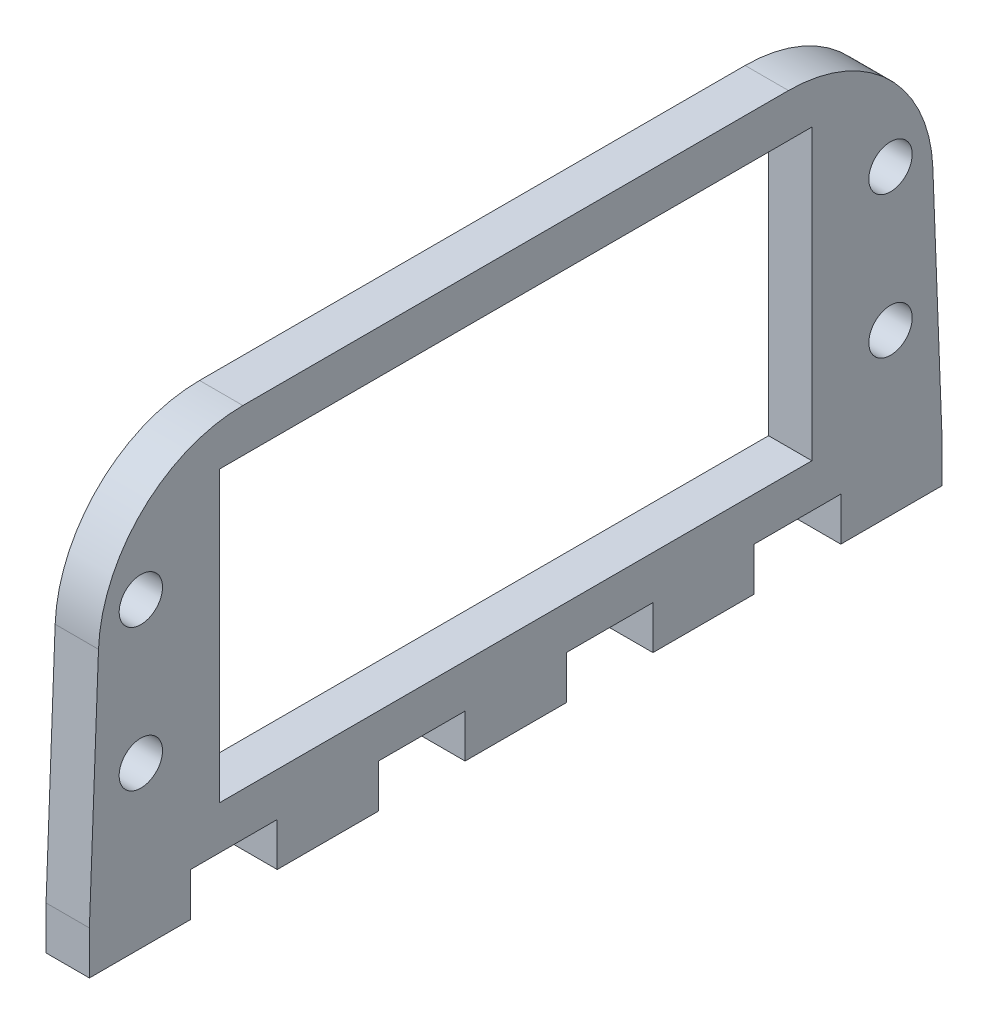
ISO-10303-21;
HEADER;
FILE_DESCRIPTION(('STEP AP214'),'2;1');
FILE_NAME('part.step','',(''),(''),'','','');
FILE_SCHEMA(('AUTOMOTIVE_DESIGN { 1 0 10303 214 1 1 1 1 }'));
ENDSEC;
DATA;
#1=APPLICATION_CONTEXT('core data for automotive mechanical design processes');
#2=APPLICATION_PROTOCOL_DEFINITION('international standard','automotive_design',2000,#1);
#3=PRODUCT_CONTEXT('',#1,'mechanical');
#4=PRODUCT('Part','Part','',(#3));
#5=PRODUCT_RELATED_PRODUCT_CATEGORY('part','',(#4));
#6=PRODUCT_DEFINITION_FORMATION('','',#4);
#7=PRODUCT_DEFINITION_CONTEXT('part definition',#1,'design');
#8=PRODUCT_DEFINITION('design','',#6,#7);
#9=PRODUCT_DEFINITION_SHAPE('','',#8);
#10=(LENGTH_UNIT() NAMED_UNIT(*) SI_UNIT(.MILLI.,.METRE.));
#11=(NAMED_UNIT(*) PLANE_ANGLE_UNIT() SI_UNIT($,.RADIAN.));
#12=(NAMED_UNIT(*) SI_UNIT($,.STERADIAN.) SOLID_ANGLE_UNIT());
#13=UNCERTAINTY_MEASURE_WITH_UNIT(LENGTH_MEASURE(1.E-05),#10,'distance_accuracy_value','');
#14=(GEOMETRIC_REPRESENTATION_CONTEXT(3) GLOBAL_UNCERTAINTY_ASSIGNED_CONTEXT((#13)) GLOBAL_UNIT_ASSIGNED_CONTEXT((#10,
#11,#12)) REPRESENTATION_CONTEXT('',''));
#15=CARTESIAN_POINT('',(0.,0.,0.));
#16=DIRECTION('',(0.,0.,1.));
#17=DIRECTION('',(1.,0.,0.));
#18=AXIS2_PLACEMENT_3D('',#15,#16,#17);
#19=CARTESIAN_POINT('',(3.,0.,0.));
#20=DIRECTION('',(-1.,0.,0.));
#21=DIRECTION('',(0.,0.,1.));
#22=AXIS2_PLACEMENT_3D('',#19,#20,#21);
#23=PLANE('',#22);
#24=CARTESIAN_POINT('',(3.,17.9,29.44));
#25=DIRECTION('',(1.,0.,0.));
#26=DIRECTION('',(0.,0.,1.));
#27=AXIS2_PLACEMENT_3D('',#24,#25,#26);
#28=CIRCLE('',#27,1.5);
#29=CARTESIAN_POINT('',(3.,17.9,30.94));
#30=VERTEX_POINT('',#29);
#31=EDGE_CURVE('E837',#30,#30,#28,.T.);
#32=ORIENTED_EDGE('',*,*,#31,.F.);
#33=EDGE_LOOP('',(#32));
#34=FACE_BOUND('',#33,.T.);
#35=CARTESIAN_POINT('',(3.,17.9,-22.44));
#36=DIRECTION('',(1.,0.,0.));
#37=DIRECTION('',(0.,0.,-1.));
#38=AXIS2_PLACEMENT_3D('',#35,#36,#37);
#39=CIRCLE('',#38,1.5);
#40=CARTESIAN_POINT('',(3.,17.9,-23.94));
#41=VERTEX_POINT('',#40);
#42=EDGE_CURVE('E254',#41,#41,#39,.T.);
#43=ORIENTED_EDGE('',*,*,#42,.F.);
#44=EDGE_LOOP('',(#43));
#45=FACE_BOUND('',#44,.T.);
#46=DIRECTION('',(0.,0.,1.));
#47=VECTOR('',#46,1.);
#48=CARTESIAN_POINT('',(3.,26.,32.));
#49=LINE('',#48,#47);
#50=CARTESIAN_POINT('',(3.,26.,-15.3772216682633));
#51=VERTEX_POINT('',#50);
#52=CARTESIAN_POINT('',(3.,26.,22.3772216682634));
#53=VERTEX_POINT('',#52);
#54=EDGE_CURVE('E307',#51,#53,#49,.T.);
#55=ORIENTED_EDGE('',*,*,#54,.T.);
#56=CARTESIAN_POINT('',(3.,16.,22.3772216682634));
#57=DIRECTION('',(-1.,0.,0.));
#58=DIRECTION('',(0.,0.,1.));
#59=AXIS2_PLACEMENT_3D('',#56,#57,#58);
#60=CIRCLE('',#59,10.);
#61=CARTESIAN_POINT('',(3.,16.3843312210121,32.3698334145765));
#62=VERTEX_POINT('',#61);
#63=EDGE_CURVE('E41',#53,#62,#60,.F.);
#64=ORIENTED_EDGE('',*,*,#63,.T.);
#65=DIRECTION('',(0.,-0.999261174631314,0.0384331221012095));
#66=VECTOR('',#65,1.);
#67=CARTESIAN_POINT('',(3.,0.,33.0000000000001));
#68=LINE('',#67,#66);
#69=CARTESIAN_POINT('',(3.,0.,33.0000000000001));
#70=VERTEX_POINT('',#69);
#71=EDGE_CURVE('E309',#62,#70,#68,.T.);
#72=ORIENTED_EDGE('',*,*,#71,.T.);
#73=DIRECTION('',(0.,-1.,0.));
#74=VECTOR('',#73,1.);
#75=CARTESIAN_POINT('',(3.,-3.,33.0000000000001));
#76=LINE('',#75,#74);
#77=CARTESIAN_POINT('',(3.,-3.,33.0000000000001));
#78=VERTEX_POINT('',#77);
#79=EDGE_CURVE('E265',#70,#78,#76,.T.);
#80=ORIENTED_EDGE('',*,*,#79,.T.);
#81=DIRECTION('',(0.,0.,-1.));
#82=VECTOR('',#81,1.);
#83=CARTESIAN_POINT('',(3.,-3.,26.0000000000001));
#84=LINE('',#83,#82);
#85=CARTESIAN_POINT('',(3.,-3.,26.0000000000001));
#86=VERTEX_POINT('',#85);
#87=EDGE_CURVE('E268',#78,#86,#84,.T.);
#88=ORIENTED_EDGE('',*,*,#87,.T.);
#89=DIRECTION('',(0.,1.,0.));
#90=VECTOR('',#89,1.);
#91=CARTESIAN_POINT('',(3.,0.,26.0000000000001));
#92=LINE('',#91,#90);
#93=CARTESIAN_POINT('',(3.,0.,26.0000000000001));
#94=VERTEX_POINT('',#93);
#95=EDGE_CURVE('E271',#86,#94,#92,.T.);
#96=ORIENTED_EDGE('',*,*,#95,.T.);
#97=DIRECTION('',(0.,0.,-1.));
#98=VECTOR('',#97,1.);
#99=CARTESIAN_POINT('',(3.,0.,20.0000000000001));
#100=LINE('',#99,#98);
#101=CARTESIAN_POINT('',(3.,0.,20.0000000000001));
#102=VERTEX_POINT('',#101);
#103=EDGE_CURVE('E273',#94,#102,#100,.T.);
#104=ORIENTED_EDGE('',*,*,#103,.T.);
#105=DIRECTION('',(0.,-1.,0.));
#106=VECTOR('',#105,1.);
#107=CARTESIAN_POINT('',(3.,-3.,20.0000000000001));
#108=LINE('',#107,#106);
#109=CARTESIAN_POINT('',(3.,-3.,20.0000000000001));
#110=VERTEX_POINT('',#109);
#111=EDGE_CURVE('E275',#102,#110,#108,.T.);
#112=ORIENTED_EDGE('',*,*,#111,.T.);
#113=DIRECTION('',(0.,0.,-1.));
#114=VECTOR('',#113,1.);
#115=CARTESIAN_POINT('',(3.,-3.,13.0000000000001));
#116=LINE('',#115,#114);
#117=CARTESIAN_POINT('',(3.,-3.,13.0000000000001));
#118=VERTEX_POINT('',#117);
#119=EDGE_CURVE('E277',#110,#118,#116,.T.);
#120=ORIENTED_EDGE('',*,*,#119,.T.);
#121=DIRECTION('',(0.,1.,0.));
#122=VECTOR('',#121,1.);
#123=CARTESIAN_POINT('',(3.,0.,13.0000000000001));
#124=LINE('',#123,#122);
#125=CARTESIAN_POINT('',(3.,0.,13.0000000000001));
#126=VERTEX_POINT('',#125);
#127=EDGE_CURVE('E279',#118,#126,#124,.T.);
#128=ORIENTED_EDGE('',*,*,#127,.T.);
#129=DIRECTION('',(0.,0.,-1.));
#130=VECTOR('',#129,1.);
#131=CARTESIAN_POINT('',(3.,0.,7.00000000000027));
#132=LINE('',#131,#130);
#133=CARTESIAN_POINT('',(3.,0.,7.00000000000027));
#134=VERTEX_POINT('',#133);
#135=EDGE_CURVE('E281',#126,#134,#132,.T.);
#136=ORIENTED_EDGE('',*,*,#135,.T.);
#137=DIRECTION('',(0.,-1.,0.));
#138=VECTOR('',#137,1.);
#139=CARTESIAN_POINT('',(3.,-3.,7.00000000000018));
#140=LINE('',#139,#138);
#141=CARTESIAN_POINT('',(3.,-3.,7.00000000000018));
#142=VERTEX_POINT('',#141);
#143=EDGE_CURVE('E283',#134,#142,#140,.T.);
#144=ORIENTED_EDGE('',*,*,#143,.T.);
#145=DIRECTION('',(0.,0.,-1.));
#146=VECTOR('',#145,1.);
#147=CARTESIAN_POINT('',(3.,-3.,0.));
#148=LINE('',#147,#146);
#149=CARTESIAN_POINT('',(3.,-3.,0.));
#150=VERTEX_POINT('',#149);
#151=EDGE_CURVE('E285',#142,#150,#148,.T.);
#152=ORIENTED_EDGE('',*,*,#151,.T.);
#153=DIRECTION('',(0.,1.,0.));
#154=VECTOR('',#153,1.);
#155=CARTESIAN_POINT('',(3.,0.,0.));
#156=LINE('',#155,#154);
#157=CARTESIAN_POINT('',(3.,0.,0.));
#158=VERTEX_POINT('',#157);
#159=EDGE_CURVE('E287',#150,#158,#156,.T.);
#160=ORIENTED_EDGE('',*,*,#159,.T.);
#161=DIRECTION('',(0.,0.,-1.));
#162=VECTOR('',#161,1.);
#163=CARTESIAN_POINT('',(3.,0.,-6.00000000000001));
#164=LINE('',#163,#162);
#165=CARTESIAN_POINT('',(3.,0.,-6.00000000000001));
#166=VERTEX_POINT('',#165);
#167=EDGE_CURVE('E289',#158,#166,#164,.T.);
#168=ORIENTED_EDGE('',*,*,#167,.T.);
#169=DIRECTION('',(0.,-1.,0.));
#170=VECTOR('',#169,1.);
#171=CARTESIAN_POINT('',(3.,-3.,-6.00000000000001));
#172=LINE('',#171,#170);
#173=CARTESIAN_POINT('',(3.,-3.,-6.00000000000001));
#174=VERTEX_POINT('',#173);
#175=EDGE_CURVE('E291',#166,#174,#172,.T.);
#176=ORIENTED_EDGE('',*,*,#175,.T.);
#177=DIRECTION('',(0.,0.,-1.));
#178=VECTOR('',#177,1.);
#179=CARTESIAN_POINT('',(3.,-3.,-13.));
#180=LINE('',#179,#178);
#181=CARTESIAN_POINT('',(3.,-3.,-13.));
#182=VERTEX_POINT('',#181);
#183=EDGE_CURVE('E293',#174,#182,#180,.T.);
#184=ORIENTED_EDGE('',*,*,#183,.T.);
#185=DIRECTION('',(0.,1.,0.));
#186=VECTOR('',#185,1.);
#187=CARTESIAN_POINT('',(3.,0.,-13.));
#188=LINE('',#187,#186);
#189=CARTESIAN_POINT('',(3.,0.,-13.));
#190=VERTEX_POINT('',#189);
#191=EDGE_CURVE('E295',#182,#190,#188,.T.);
#192=ORIENTED_EDGE('',*,*,#191,.T.);
#193=DIRECTION('',(0.,0.,-1.));
#194=VECTOR('',#193,1.);
#195=CARTESIAN_POINT('',(3.,0.,-19.));
#196=LINE('',#195,#194);
#197=CARTESIAN_POINT('',(3.,0.,-19.));
#198=VERTEX_POINT('',#197);
#199=EDGE_CURVE('E297',#190,#198,#196,.T.);
#200=ORIENTED_EDGE('',*,*,#199,.T.);
#201=DIRECTION('',(0.,-1.,0.));
#202=VECTOR('',#201,1.);
#203=CARTESIAN_POINT('',(3.,-3.,-19.));
#204=LINE('',#203,#202);
#205=CARTESIAN_POINT('',(3.,-3.,-19.));
#206=VERTEX_POINT('',#205);
#207=EDGE_CURVE('E299',#198,#206,#204,.T.);
#208=ORIENTED_EDGE('',*,*,#207,.T.);
#209=DIRECTION('',(0.,0.,-1.));
#210=VECTOR('',#209,1.);
#211=CARTESIAN_POINT('',(3.,-3.,-26.));
#212=LINE('',#211,#210);
#213=CARTESIAN_POINT('',(3.,-3.,-26.));
#214=VERTEX_POINT('',#213);
#215=EDGE_CURVE('E301',#206,#214,#212,.T.);
#216=ORIENTED_EDGE('',*,*,#215,.T.);
#217=DIRECTION('',(0.,1.,0.));
#218=VECTOR('',#217,1.);
#219=CARTESIAN_POINT('',(3.,0.,-26.0000000000001));
#220=LINE('',#219,#218);
#221=CARTESIAN_POINT('',(3.,0.,-26.0000000000001));
#222=VERTEX_POINT('',#221);
#223=EDGE_CURVE('E303',#214,#222,#220,.T.);
#224=ORIENTED_EDGE('',*,*,#223,.T.);
#225=DIRECTION('',(0.,0.999261174631314,0.0384331221012076));
#226=VECTOR('',#225,1.);
#227=CARTESIAN_POINT('',(3.,26.,-25.));
#228=LINE('',#227,#226);
#229=CARTESIAN_POINT('',(3.,16.3843312210121,-25.3698334145765));
#230=VERTEX_POINT('',#229);
#231=EDGE_CURVE('E305',#222,#230,#228,.T.);
#232=ORIENTED_EDGE('',*,*,#231,.T.);
#233=CARTESIAN_POINT('',(3.,16.,-15.3772216682634));
#234=DIRECTION('',(-1.,0.,0.));
#235=DIRECTION('',(0.,0.,1.));
#236=AXIS2_PLACEMENT_3D('',#233,#234,#235);
#237=CIRCLE('',#236,10.);
#238=EDGE_CURVE('E425',#230,#51,#237,.F.);
#239=ORIENTED_EDGE('',*,*,#238,.T.);
#240=EDGE_LOOP('',(#55,#64,#72,#80,#88,#96,#104,#112,#120,#128,#136,#144,#152,#160,#168,#176,
#184,#192,#200,#208,#216,#224,#232,#239));
#241=FACE_BOUND('',#240,.T.);
#242=DIRECTION('',(0.,1.,0.));
#243=VECTOR('',#242,1.);
#244=CARTESIAN_POINT('',(3.,23.,-17.));
#245=LINE('',#244,#243);
#246=CARTESIAN_POINT('',(3.,3.,-17.));
#247=VERTEX_POINT('',#246);
#248=CARTESIAN_POINT('',(3.,23.,-17.));
#249=VERTEX_POINT('',#248);
#250=EDGE_CURVE('E221',#247,#249,#245,.T.);
#251=ORIENTED_EDGE('',*,*,#250,.F.);
#252=DIRECTION('',(0.,0.,-1.));
#253=VECTOR('',#252,1.);
#254=CARTESIAN_POINT('',(3.,3.,24.));
#255=LINE('',#254,#253);
#256=CARTESIAN_POINT('',(3.,3.,24.));
#257=VERTEX_POINT('',#256);
#258=EDGE_CURVE('E247',#257,#247,#255,.T.);
#259=ORIENTED_EDGE('',*,*,#258,.F.);
#260=DIRECTION('',(0.,-1.,0.));
#261=VECTOR('',#260,1.);
#262=CARTESIAN_POINT('',(3.,23.,24.));
#263=LINE('',#262,#261);
#264=CARTESIAN_POINT('',(3.,23.,24.));
#265=VERTEX_POINT('',#264);
#266=EDGE_CURVE('E245',#265,#257,#263,.T.);
#267=ORIENTED_EDGE('',*,*,#266,.F.);
#268=DIRECTION('',(0.,0.,1.));
#269=VECTOR('',#268,1.);
#270=CARTESIAN_POINT('',(3.,23.,24.));
#271=LINE('',#270,#269);
#272=EDGE_CURVE('E231',#249,#265,#271,.T.);
#273=ORIENTED_EDGE('',*,*,#272,.F.);
#274=EDGE_LOOP('',(#251,#259,#267,#273));
#275=FACE_BOUND('',#274,.T.);
#276=CARTESIAN_POINT('',(3.,8.1,-22.44));
#277=DIRECTION('',(1.,0.,0.));
#278=DIRECTION('',(0.,0.,1.));
#279=AXIS2_PLACEMENT_3D('',#276,#277,#278);
#280=CIRCLE('',#279,1.5);
#281=CARTESIAN_POINT('',(3.,8.1,-20.94));
#282=VERTEX_POINT('',#281);
#283=EDGE_CURVE('E843',#282,#282,#280,.T.);
#284=ORIENTED_EDGE('',*,*,#283,.F.);
#285=EDGE_LOOP('',(#284));
#286=FACE_BOUND('',#285,.T.);
#287=CARTESIAN_POINT('',(3.,8.1,29.44));
#288=DIRECTION('',(1.,0.,0.));
#289=DIRECTION('',(0.,0.,-1.));
#290=AXIS2_PLACEMENT_3D('',#287,#288,#289);
#291=CIRCLE('',#290,1.5);
#292=CARTESIAN_POINT('',(3.,8.1,27.94));
#293=VERTEX_POINT('',#292);
#294=EDGE_CURVE('E828',#293,#293,#291,.T.);
#295=ORIENTED_EDGE('',*,*,#294,.F.);
#296=EDGE_LOOP('',(#295));
#297=FACE_BOUND('',#296,.T.);
#298=ADVANCED_FACE('F33',(#34,#45,#241,#275,#286,#297),#23,.F.);
#299=CARTESIAN_POINT('',(0.,0.,0.));
#300=DIRECTION('',(-1.,0.,0.));
#301=DIRECTION('',(0.,0.,1.));
#302=AXIS2_PLACEMENT_3D('',#299,#300,#301);
#303=PLANE('',#302);
#304=CARTESIAN_POINT('',(0.,17.9,29.44));
#305=DIRECTION('',(1.,0.,0.));
#306=DIRECTION('',(0.,0.,1.));
#307=AXIS2_PLACEMENT_3D('',#304,#305,#306);
#308=CIRCLE('',#307,1.5);
#309=CARTESIAN_POINT('',(0.,17.9,30.94));
#310=VERTEX_POINT('',#309);
#311=EDGE_CURVE('E834',#310,#310,#308,.T.);
#312=ORIENTED_EDGE('',*,*,#311,.T.);
#313=EDGE_LOOP('',(#312));
#314=FACE_BOUND('',#313,.T.);
#315=CARTESIAN_POINT('',(0.,17.9,-22.44));
#316=DIRECTION('',(1.,0.,0.));
#317=DIRECTION('',(0.,0.,-1.));
#318=AXIS2_PLACEMENT_3D('',#315,#316,#317);
#319=CIRCLE('',#318,1.5);
#320=CARTESIAN_POINT('',(0.,17.9,-23.94));
#321=VERTEX_POINT('',#320);
#322=EDGE_CURVE('E846',#321,#321,#319,.T.);
#323=ORIENTED_EDGE('',*,*,#322,.T.);
#324=EDGE_LOOP('',(#323));
#325=FACE_BOUND('',#324,.T.);
#326=DIRECTION('',(0.,-0.999261174631314,0.0384331221012095));
#327=VECTOR('',#326,1.);
#328=CARTESIAN_POINT('',(0.,0.,33.0000000000001));
#329=LINE('',#328,#327);
#330=CARTESIAN_POINT('',(0.,16.3843312210121,32.3698334145765));
#331=VERTEX_POINT('',#330);
#332=CARTESIAN_POINT('',(0.,0.,33.0000000000001));
#333=VERTEX_POINT('',#332);
#334=EDGE_CURVE('E269',#331,#333,#329,.T.);
#335=ORIENTED_EDGE('',*,*,#334,.F.);
#336=CARTESIAN_POINT('',(0.,16.,22.3772216682634));
#337=DIRECTION('',(-1.,0.,0.));
#338=DIRECTION('',(0.,0.,1.));
#339=AXIS2_PLACEMENT_3D('',#336,#337,#338);
#340=CIRCLE('',#339,10.);
#341=CARTESIAN_POINT('',(0.,26.,22.3772216682634));
#342=VERTEX_POINT('',#341);
#343=EDGE_CURVE('E419',#331,#342,#340,.T.);
#344=ORIENTED_EDGE('',*,*,#343,.T.);
#345=DIRECTION('',(0.,0.,1.));
#346=VECTOR('',#345,1.);
#347=CARTESIAN_POINT('',(0.,26.,32.));
#348=LINE('',#347,#346);
#349=CARTESIAN_POINT('',(0.,26.,-15.3772216682633));
#350=VERTEX_POINT('',#349);
#351=EDGE_CURVE('E352',#350,#342,#348,.T.);
#352=ORIENTED_EDGE('',*,*,#351,.F.);
#353=CARTESIAN_POINT('',(0.,16.,-15.3772216682634));
#354=DIRECTION('',(-1.,0.,0.));
#355=DIRECTION('',(0.,0.,1.));
#356=AXIS2_PLACEMENT_3D('',#353,#354,#355);
#357=CIRCLE('',#356,10.);
#358=CARTESIAN_POINT('',(0.,16.3843312210121,-25.3698334145765));
#359=VERTEX_POINT('',#358);
#360=EDGE_CURVE('E417',#350,#359,#357,.T.);
#361=ORIENTED_EDGE('',*,*,#360,.T.);
#362=DIRECTION('',(0.,0.999261174631314,0.0384331221012076));
#363=VECTOR('',#362,1.);
#364=CARTESIAN_POINT('',(0.,26.,-25.));
#365=LINE('',#364,#363);
#366=CARTESIAN_POINT('',(0.,0.,-26.0000000000001));
#367=VERTEX_POINT('',#366);
#368=EDGE_CURVE('E350',#367,#359,#365,.T.);
#369=ORIENTED_EDGE('',*,*,#368,.F.);
#370=DIRECTION('',(0.,1.,0.));
#371=VECTOR('',#370,1.);
#372=CARTESIAN_POINT('',(0.,0.,-26.0000000000001));
#373=LINE('',#372,#371);
#374=CARTESIAN_POINT('',(0.,-3.,-26.));
#375=VERTEX_POINT('',#374);
#376=EDGE_CURVE('E348',#375,#367,#373,.T.);
#377=ORIENTED_EDGE('',*,*,#376,.F.);
#378=DIRECTION('',(0.,0.,-1.));
#379=VECTOR('',#378,1.);
#380=CARTESIAN_POINT('',(0.,-3.,-26.));
#381=LINE('',#380,#379);
#382=CARTESIAN_POINT('',(0.,-3.,-19.));
#383=VERTEX_POINT('',#382);
#384=EDGE_CURVE('E346',#383,#375,#381,.T.);
#385=ORIENTED_EDGE('',*,*,#384,.F.);
#386=DIRECTION('',(0.,-1.,0.));
#387=VECTOR('',#386,1.);
#388=CARTESIAN_POINT('',(0.,-3.,-19.));
#389=LINE('',#388,#387);
#390=CARTESIAN_POINT('',(0.,0.,-19.));
#391=VERTEX_POINT('',#390);
#392=EDGE_CURVE('E344',#391,#383,#389,.T.);
#393=ORIENTED_EDGE('',*,*,#392,.F.);
#394=DIRECTION('',(0.,0.,-1.));
#395=VECTOR('',#394,1.);
#396=CARTESIAN_POINT('',(0.,0.,-19.));
#397=LINE('',#396,#395);
#398=CARTESIAN_POINT('',(0.,0.,-13.));
#399=VERTEX_POINT('',#398);
#400=EDGE_CURVE('E342',#399,#391,#397,.T.);
#401=ORIENTED_EDGE('',*,*,#400,.F.);
#402=DIRECTION('',(0.,1.,0.));
#403=VECTOR('',#402,1.);
#404=CARTESIAN_POINT('',(0.,0.,-13.));
#405=LINE('',#404,#403);
#406=CARTESIAN_POINT('',(0.,-3.,-13.));
#407=VERTEX_POINT('',#406);
#408=EDGE_CURVE('E340',#407,#399,#405,.T.);
#409=ORIENTED_EDGE('',*,*,#408,.F.);
#410=DIRECTION('',(0.,0.,-1.));
#411=VECTOR('',#410,1.);
#412=CARTESIAN_POINT('',(0.,-3.,-13.));
#413=LINE('',#412,#411);
#414=CARTESIAN_POINT('',(0.,-3.,-6.00000000000001));
#415=VERTEX_POINT('',#414);
#416=EDGE_CURVE('E338',#415,#407,#413,.T.);
#417=ORIENTED_EDGE('',*,*,#416,.F.);
#418=DIRECTION('',(0.,-1.,0.));
#419=VECTOR('',#418,1.);
#420=CARTESIAN_POINT('',(0.,-3.,-6.00000000000001));
#421=LINE('',#420,#419);
#422=CARTESIAN_POINT('',(0.,0.,-6.00000000000001));
#423=VERTEX_POINT('',#422);
#424=EDGE_CURVE('E336',#423,#415,#421,.T.);
#425=ORIENTED_EDGE('',*,*,#424,.F.);
#426=DIRECTION('',(0.,0.,-1.));
#427=VECTOR('',#426,1.);
#428=CARTESIAN_POINT('',(0.,0.,-6.00000000000001));
#429=LINE('',#428,#427);
#430=CARTESIAN_POINT('',(0.,0.,0.));
#431=VERTEX_POINT('',#430);
#432=EDGE_CURVE('E334',#431,#423,#429,.T.);
#433=ORIENTED_EDGE('',*,*,#432,.F.);
#434=DIRECTION('',(0.,1.,0.));
#435=VECTOR('',#434,1.);
#436=CARTESIAN_POINT('',(0.,0.,0.));
#437=LINE('',#436,#435);
#438=CARTESIAN_POINT('',(0.,-3.,0.));
#439=VERTEX_POINT('',#438);
#440=EDGE_CURVE('E332',#439,#431,#437,.T.);
#441=ORIENTED_EDGE('',*,*,#440,.F.);
#442=DIRECTION('',(0.,0.,-1.));
#443=VECTOR('',#442,1.);
#444=CARTESIAN_POINT('',(0.,-3.,0.));
#445=LINE('',#444,#443);
#446=CARTESIAN_POINT('',(0.,-3.,7.00000000000018));
#447=VERTEX_POINT('',#446);
#448=EDGE_CURVE('E330',#447,#439,#445,.T.);
#449=ORIENTED_EDGE('',*,*,#448,.F.);
#450=DIRECTION('',(0.,-1.,0.));
#451=VECTOR('',#450,1.);
#452=CARTESIAN_POINT('',(0.,-3.,7.00000000000018));
#453=LINE('',#452,#451);
#454=CARTESIAN_POINT('',(0.,0.,7.00000000000027));
#455=VERTEX_POINT('',#454);
#456=EDGE_CURVE('E328',#455,#447,#453,.T.);
#457=ORIENTED_EDGE('',*,*,#456,.F.);
#458=DIRECTION('',(0.,0.,-1.));
#459=VECTOR('',#458,1.);
#460=CARTESIAN_POINT('',(0.,0.,7.00000000000027));
#461=LINE('',#460,#459);
#462=CARTESIAN_POINT('',(0.,0.,13.0000000000001));
#463=VERTEX_POINT('',#462);
#464=EDGE_CURVE('E326',#463,#455,#461,.T.);
#465=ORIENTED_EDGE('',*,*,#464,.F.);
#466=DIRECTION('',(0.,1.,0.));
#467=VECTOR('',#466,1.);
#468=CARTESIAN_POINT('',(0.,0.,13.0000000000001));
#469=LINE('',#468,#467);
#470=CARTESIAN_POINT('',(0.,-3.,13.0000000000001));
#471=VERTEX_POINT('',#470);
#472=EDGE_CURVE('E324',#471,#463,#469,.T.);
#473=ORIENTED_EDGE('',*,*,#472,.F.);
#474=DIRECTION('',(0.,0.,-1.));
#475=VECTOR('',#474,1.);
#476=CARTESIAN_POINT('',(0.,-3.,13.0000000000001));
#477=LINE('',#476,#475);
#478=CARTESIAN_POINT('',(0.,-3.,20.0000000000001));
#479=VERTEX_POINT('',#478);
#480=EDGE_CURVE('E322',#479,#471,#477,.T.);
#481=ORIENTED_EDGE('',*,*,#480,.F.);
#482=DIRECTION('',(0.,-1.,0.));
#483=VECTOR('',#482,1.);
#484=CARTESIAN_POINT('',(0.,-3.,20.0000000000001));
#485=LINE('',#484,#483);
#486=CARTESIAN_POINT('',(0.,0.,20.0000000000001));
#487=VERTEX_POINT('',#486);
#488=EDGE_CURVE('E320',#487,#479,#485,.T.);
#489=ORIENTED_EDGE('',*,*,#488,.F.);
#490=DIRECTION('',(0.,0.,-1.));
#491=VECTOR('',#490,1.);
#492=CARTESIAN_POINT('',(0.,0.,20.0000000000001));
#493=LINE('',#492,#491);
#494=CARTESIAN_POINT('',(0.,0.,26.0000000000001));
#495=VERTEX_POINT('',#494);
#496=EDGE_CURVE('E318',#495,#487,#493,.T.);
#497=ORIENTED_EDGE('',*,*,#496,.F.);
#498=DIRECTION('',(0.,1.,0.));
#499=VECTOR('',#498,1.);
#500=CARTESIAN_POINT('',(0.,0.,26.0000000000001));
#501=LINE('',#500,#499);
#502=CARTESIAN_POINT('',(0.,-3.,26.0000000000001));
#503=VERTEX_POINT('',#502);
#504=EDGE_CURVE('E316',#503,#495,#501,.T.);
#505=ORIENTED_EDGE('',*,*,#504,.F.);
#506=DIRECTION('',(0.,0.,-1.));
#507=VECTOR('',#506,1.);
#508=CARTESIAN_POINT('',(0.,-3.,26.0000000000001));
#509=LINE('',#508,#507);
#510=CARTESIAN_POINT('',(0.,-3.,33.0000000000001));
#511=VERTEX_POINT('',#510);
#512=EDGE_CURVE('E314',#511,#503,#509,.T.);
#513=ORIENTED_EDGE('',*,*,#512,.F.);
#514=DIRECTION('',(0.,-1.,0.));
#515=VECTOR('',#514,1.);
#516=CARTESIAN_POINT('',(0.,-3.,33.0000000000001));
#517=LINE('',#516,#515);
#518=EDGE_CURVE('E239',#333,#511,#517,.T.);
#519=ORIENTED_EDGE('',*,*,#518,.F.);
#520=EDGE_LOOP('',(#335,#344,#352,#361,#369,#377,#385,#393,#401,#409,#417,#425,#433,#441,#449,
#457,#465,#473,#481,#489,#497,#505,#513,#519));
#521=FACE_BOUND('',#520,.T.);
#522=DIRECTION('',(0.,0.,-1.));
#523=VECTOR('',#522,1.);
#524=CARTESIAN_POINT('',(0.,3.,24.));
#525=LINE('',#524,#523);
#526=CARTESIAN_POINT('',(0.,3.,24.));
#527=VERTEX_POINT('',#526);
#528=CARTESIAN_POINT('',(0.,3.,-17.));
#529=VERTEX_POINT('',#528);
#530=EDGE_CURVE('E232',#527,#529,#525,.T.);
#531=ORIENTED_EDGE('',*,*,#530,.T.);
#532=DIRECTION('',(0.,1.,0.));
#533=VECTOR('',#532,1.);
#534=CARTESIAN_POINT('',(0.,23.,-17.));
#535=LINE('',#534,#533);
#536=CARTESIAN_POINT('',(0.,23.,-17.));
#537=VERTEX_POINT('',#536);
#538=EDGE_CURVE('E252',#529,#537,#535,.T.);
#539=ORIENTED_EDGE('',*,*,#538,.T.);
#540=DIRECTION('',(0.,0.,1.));
#541=VECTOR('',#540,1.);
#542=CARTESIAN_POINT('',(0.,23.,24.));
#543=LINE('',#542,#541);
#544=CARTESIAN_POINT('',(0.,23.,24.));
#545=VERTEX_POINT('',#544);
#546=EDGE_CURVE('E238',#537,#545,#543,.T.);
#547=ORIENTED_EDGE('',*,*,#546,.T.);
#548=DIRECTION('',(0.,-1.,0.));
#549=VECTOR('',#548,1.);
#550=CARTESIAN_POINT('',(0.,23.,24.));
#551=LINE('',#550,#549);
#552=EDGE_CURVE('E256',#545,#527,#551,.T.);
#553=ORIENTED_EDGE('',*,*,#552,.T.);
#554=EDGE_LOOP('',(#531,#539,#547,#553));
#555=FACE_BOUND('',#554,.T.);
#556=CARTESIAN_POINT('',(0.,8.1,-22.44));
#557=DIRECTION('',(1.,0.,0.));
#558=DIRECTION('',(0.,0.,1.));
#559=AXIS2_PLACEMENT_3D('',#556,#557,#558);
#560=CIRCLE('',#559,1.5);
#561=CARTESIAN_POINT('',(0.,8.1,-20.94));
#562=VERTEX_POINT('',#561);
#563=EDGE_CURVE('E840',#562,#562,#560,.T.);
#564=ORIENTED_EDGE('',*,*,#563,.T.);
#565=EDGE_LOOP('',(#564));
#566=FACE_BOUND('',#565,.T.);
#567=CARTESIAN_POINT('',(0.,8.1,29.44));
#568=DIRECTION('',(1.,0.,0.));
#569=DIRECTION('',(0.,0.,-1.));
#570=AXIS2_PLACEMENT_3D('',#567,#568,#569);
#571=CIRCLE('',#570,1.5);
#572=CARTESIAN_POINT('',(0.,8.1,27.94));
#573=VERTEX_POINT('',#572);
#574=EDGE_CURVE('E831',#573,#573,#571,.T.);
#575=ORIENTED_EDGE('',*,*,#574,.T.);
#576=EDGE_LOOP('',(#575));
#577=FACE_BOUND('',#576,.T.);
#578=ADVANCED_FACE('F439',(#314,#325,#521,#555,#566,#577),#303,.T.);
#579=CARTESIAN_POINT('',(3.,-3.,33.0000000000001));
#580=DIRECTION('',(0.,0.,-1.));
#581=DIRECTION('',(0.,1.,0.));
#582=AXIS2_PLACEMENT_3D('',#579,#580,#581);
#583=PLANE('',#582);
#584=ORIENTED_EDGE('',*,*,#518,.T.);
#585=DIRECTION('',(-1.,0.,0.));
#586=VECTOR('',#585,1.);
#587=CARTESIAN_POINT('',(3.,-3.,33.0000000000001));
#588=LINE('',#587,#586);
#589=EDGE_CURVE('E411',#78,#511,#588,.T.);
#590=ORIENTED_EDGE('',*,*,#589,.F.);
#591=ORIENTED_EDGE('',*,*,#79,.F.);
#592=DIRECTION('',(-1.,0.,0.));
#593=VECTOR('',#592,1.);
#594=CARTESIAN_POINT('',(3.,0.,33.0000000000001));
#595=LINE('',#594,#593);
#596=EDGE_CURVE('E311',#70,#333,#595,.T.);
#597=ORIENTED_EDGE('',*,*,#596,.T.);
#598=EDGE_LOOP('',(#584,#590,#591,#597));
#599=FACE_BOUND('',#598,.T.);
#600=ADVANCED_FACE('F538',(#599),#583,.F.);
#601=CARTESIAN_POINT('',(3.,-3.,26.0000000000001));
#602=DIRECTION('',(0.,1.,0.));
#603=DIRECTION('',(0.,0.,1.));
#604=AXIS2_PLACEMENT_3D('',#601,#602,#603);
#605=PLANE('',#604);
#606=ORIENTED_EDGE('',*,*,#512,.T.);
#607=DIRECTION('',(-1.,0.,0.));
#608=VECTOR('',#607,1.);
#609=CARTESIAN_POINT('',(3.,-3.,26.0000000000001));
#610=LINE('',#609,#608);
#611=EDGE_CURVE('E408',#86,#503,#610,.T.);
#612=ORIENTED_EDGE('',*,*,#611,.F.);
#613=ORIENTED_EDGE('',*,*,#87,.F.);
#614=ORIENTED_EDGE('',*,*,#589,.T.);
#615=EDGE_LOOP('',(#606,#612,#613,#614));
#616=FACE_BOUND('',#615,.T.);
#617=ADVANCED_FACE('F535',(#616),#605,.F.);
#618=CARTESIAN_POINT('',(3.,0.,26.0000000000001));
#619=DIRECTION('',(0.,0.,1.));
#620=DIRECTION('',(1.,0.,0.));
#621=AXIS2_PLACEMENT_3D('',#618,#619,#620);
#622=PLANE('',#621);
#623=ORIENTED_EDGE('',*,*,#504,.T.);
#624=DIRECTION('',(-1.,0.,0.));
#625=VECTOR('',#624,1.);
#626=CARTESIAN_POINT('',(3.,0.,26.0000000000001));
#627=LINE('',#626,#625);
#628=EDGE_CURVE('E405',#94,#495,#627,.T.);
#629=ORIENTED_EDGE('',*,*,#628,.F.);
#630=ORIENTED_EDGE('',*,*,#95,.F.);
#631=ORIENTED_EDGE('',*,*,#611,.T.);
#632=EDGE_LOOP('',(#623,#629,#630,#631));
#633=FACE_BOUND('',#632,.T.);
#634=ADVANCED_FACE('F531',(#633),#622,.F.);
#635=CARTESIAN_POINT('',(3.,0.,20.0000000000001));
#636=DIRECTION('',(0.,1.,0.));
#637=DIRECTION('',(0.,0.,1.));
#638=AXIS2_PLACEMENT_3D('',#635,#636,#637);
#639=PLANE('',#638);
#640=ORIENTED_EDGE('',*,*,#496,.T.);
#641=DIRECTION('',(-1.,0.,0.));
#642=VECTOR('',#641,1.);
#643=CARTESIAN_POINT('',(3.,0.,20.0000000000001));
#644=LINE('',#643,#642);
#645=EDGE_CURVE('E402',#102,#487,#644,.T.);
#646=ORIENTED_EDGE('',*,*,#645,.F.);
#647=ORIENTED_EDGE('',*,*,#103,.F.);
#648=ORIENTED_EDGE('',*,*,#628,.T.);
#649=EDGE_LOOP('',(#640,#646,#647,#648));
#650=FACE_BOUND('',#649,.T.);
#651=ADVANCED_FACE('F527',(#650),#639,.F.);
#652=CARTESIAN_POINT('',(3.,-3.,20.0000000000001));
#653=DIRECTION('',(0.,0.,-1.));
#654=DIRECTION('',(-1.,0.,0.));
#655=AXIS2_PLACEMENT_3D('',#652,#653,#654);
#656=PLANE('',#655);
#657=ORIENTED_EDGE('',*,*,#488,.T.);
#658=DIRECTION('',(-1.,0.,0.));
#659=VECTOR('',#658,1.);
#660=CARTESIAN_POINT('',(3.,-3.,20.0000000000001));
#661=LINE('',#660,#659);
#662=EDGE_CURVE('E399',#110,#479,#661,.T.);
#663=ORIENTED_EDGE('',*,*,#662,.F.);
#664=ORIENTED_EDGE('',*,*,#111,.F.);
#665=ORIENTED_EDGE('',*,*,#645,.T.);
#666=EDGE_LOOP('',(#657,#663,#664,#665));
#667=FACE_BOUND('',#666,.T.);
#668=ADVANCED_FACE('F523',(#667),#656,.F.);
#669=CARTESIAN_POINT('',(3.,-3.,13.0000000000001));
#670=DIRECTION('',(0.,1.,0.));
#671=DIRECTION('',(0.,0.,1.));
#672=AXIS2_PLACEMENT_3D('',#669,#670,#671);
#673=PLANE('',#672);
#674=ORIENTED_EDGE('',*,*,#480,.T.);
#675=DIRECTION('',(-1.,0.,0.));
#676=VECTOR('',#675,1.);
#677=CARTESIAN_POINT('',(3.,-3.,13.0000000000001));
#678=LINE('',#677,#676);
#679=EDGE_CURVE('E396',#118,#471,#678,.T.);
#680=ORIENTED_EDGE('',*,*,#679,.F.);
#681=ORIENTED_EDGE('',*,*,#119,.F.);
#682=ORIENTED_EDGE('',*,*,#662,.T.);
#683=EDGE_LOOP('',(#674,#680,#681,#682));
#684=FACE_BOUND('',#683,.T.);
#685=ADVANCED_FACE('F518',(#684),#673,.F.);
#686=CARTESIAN_POINT('',(3.,0.,13.0000000000001));
#687=DIRECTION('',(0.,0.,1.));
#688=DIRECTION('',(1.,0.,0.));
#689=AXIS2_PLACEMENT_3D('',#686,#687,#688);
#690=PLANE('',#689);
#691=ORIENTED_EDGE('',*,*,#472,.T.);
#692=DIRECTION('',(-1.,0.,0.));
#693=VECTOR('',#692,1.);
#694=CARTESIAN_POINT('',(3.,0.,13.0000000000001));
#695=LINE('',#694,#693);
#696=EDGE_CURVE('E393',#126,#463,#695,.T.);
#697=ORIENTED_EDGE('',*,*,#696,.F.);
#698=ORIENTED_EDGE('',*,*,#127,.F.);
#699=ORIENTED_EDGE('',*,*,#679,.T.);
#700=EDGE_LOOP('',(#691,#697,#698,#699));
#701=FACE_BOUND('',#700,.T.);
#702=ADVANCED_FACE('F512',(#701),#690,.F.);
#703=CARTESIAN_POINT('',(3.,0.,7.00000000000027));
#704=DIRECTION('',(0.,1.,0.));
#705=DIRECTION('',(0.,0.,1.));
#706=AXIS2_PLACEMENT_3D('',#703,#704,#705);
#707=PLANE('',#706);
#708=ORIENTED_EDGE('',*,*,#464,.T.);
#709=DIRECTION('',(-1.,0.,0.));
#710=VECTOR('',#709,1.);
#711=CARTESIAN_POINT('',(3.,0.,7.00000000000027));
#712=LINE('',#711,#710);
#713=EDGE_CURVE('E390',#134,#455,#712,.T.);
#714=ORIENTED_EDGE('',*,*,#713,.F.);
#715=ORIENTED_EDGE('',*,*,#135,.F.);
#716=ORIENTED_EDGE('',*,*,#696,.T.);
#717=EDGE_LOOP('',(#708,#714,#715,#716));
#718=FACE_BOUND('',#717,.T.);
#719=ADVANCED_FACE('F508',(#718),#707,.F.);
#720=CARTESIAN_POINT('',(3.,-3.,7.00000000000018));
#721=DIRECTION('',(0.,0.,-1.));
#722=DIRECTION('',(0.,1.,0.));
#723=AXIS2_PLACEMENT_3D('',#720,#721,#722);
#724=PLANE('',#723);
#725=ORIENTED_EDGE('',*,*,#456,.T.);
#726=DIRECTION('',(-1.,0.,0.));
#727=VECTOR('',#726,1.);
#728=CARTESIAN_POINT('',(3.,-3.,7.00000000000018));
#729=LINE('',#728,#727);
#730=EDGE_CURVE('E387',#142,#447,#729,.T.);
#731=ORIENTED_EDGE('',*,*,#730,.F.);
#732=ORIENTED_EDGE('',*,*,#143,.F.);
#733=ORIENTED_EDGE('',*,*,#713,.T.);
#734=EDGE_LOOP('',(#725,#731,#732,#733));
#735=FACE_BOUND('',#734,.T.);
#736=ADVANCED_FACE('F503',(#735),#724,.F.);
#737=CARTESIAN_POINT('',(3.,-3.,0.));
#738=DIRECTION('',(0.,1.,0.));
#739=DIRECTION('',(0.,0.,1.));
#740=AXIS2_PLACEMENT_3D('',#737,#738,#739);
#741=PLANE('',#740);
#742=ORIENTED_EDGE('',*,*,#448,.T.);
#743=DIRECTION('',(-1.,0.,0.));
#744=VECTOR('',#743,1.);
#745=CARTESIAN_POINT('',(3.,-3.,0.));
#746=LINE('',#745,#744);
#747=EDGE_CURVE('E384',#150,#439,#746,.T.);
#748=ORIENTED_EDGE('',*,*,#747,.F.);
#749=ORIENTED_EDGE('',*,*,#151,.F.);
#750=ORIENTED_EDGE('',*,*,#730,.T.);
#751=EDGE_LOOP('',(#742,#748,#749,#750));
#752=FACE_BOUND('',#751,.T.);
#753=ADVANCED_FACE('F497',(#752),#741,.F.);
#754=CARTESIAN_POINT('',(3.,0.,0.));
#755=DIRECTION('',(0.,0.,1.));
#756=DIRECTION('',(0.,-1.,0.));
#757=AXIS2_PLACEMENT_3D('',#754,#755,#756);
#758=PLANE('',#757);
#759=ORIENTED_EDGE('',*,*,#440,.T.);
#760=DIRECTION('',(-1.,0.,0.));
#761=VECTOR('',#760,1.);
#762=CARTESIAN_POINT('',(3.,0.,0.));
#763=LINE('',#762,#761);
#764=EDGE_CURVE('E381',#158,#431,#763,.T.);
#765=ORIENTED_EDGE('',*,*,#764,.F.);
#766=ORIENTED_EDGE('',*,*,#159,.F.);
#767=ORIENTED_EDGE('',*,*,#747,.T.);
#768=EDGE_LOOP('',(#759,#765,#766,#767));
#769=FACE_BOUND('',#768,.T.);
#770=ADVANCED_FACE('F493',(#769),#758,.F.);
#771=CARTESIAN_POINT('',(3.,0.,-6.00000000000001));
#772=DIRECTION('',(0.,1.,0.));
#773=DIRECTION('',(0.,0.,1.));
#774=AXIS2_PLACEMENT_3D('',#771,#772,#773);
#775=PLANE('',#774);
#776=ORIENTED_EDGE('',*,*,#432,.T.);
#777=DIRECTION('',(-1.,0.,0.));
#778=VECTOR('',#777,1.);
#779=CARTESIAN_POINT('',(3.,0.,-6.00000000000001));
#780=LINE('',#779,#778);
#781=EDGE_CURVE('E378',#166,#423,#780,.T.);
#782=ORIENTED_EDGE('',*,*,#781,.F.);
#783=ORIENTED_EDGE('',*,*,#167,.F.);
#784=ORIENTED_EDGE('',*,*,#764,.T.);
#785=EDGE_LOOP('',(#776,#782,#783,#784));
#786=FACE_BOUND('',#785,.T.);
#787=ADVANCED_FACE('F488',(#786),#775,.F.);
#788=CARTESIAN_POINT('',(3.,-3.,-6.00000000000001));
#789=DIRECTION('',(0.,0.,-1.));
#790=DIRECTION('',(-1.,0.,0.));
#791=AXIS2_PLACEMENT_3D('',#788,#789,#790);
#792=PLANE('',#791);
#793=ORIENTED_EDGE('',*,*,#424,.T.);
#794=DIRECTION('',(-1.,0.,0.));
#795=VECTOR('',#794,1.);
#796=CARTESIAN_POINT('',(3.,-3.,-6.00000000000001));
#797=LINE('',#796,#795);
#798=EDGE_CURVE('E375',#174,#415,#797,.T.);
#799=ORIENTED_EDGE('',*,*,#798,.F.);
#800=ORIENTED_EDGE('',*,*,#175,.F.);
#801=ORIENTED_EDGE('',*,*,#781,.T.);
#802=EDGE_LOOP('',(#793,#799,#800,#801));
#803=FACE_BOUND('',#802,.T.);
#804=ADVANCED_FACE('F482',(#803),#792,.F.);
#805=CARTESIAN_POINT('',(3.,-3.,-13.));
#806=DIRECTION('',(0.,1.,0.));
#807=DIRECTION('',(0.,0.,1.));
#808=AXIS2_PLACEMENT_3D('',#805,#806,#807);
#809=PLANE('',#808);
#810=ORIENTED_EDGE('',*,*,#416,.T.);
#811=DIRECTION('',(-1.,0.,0.));
#812=VECTOR('',#811,1.);
#813=CARTESIAN_POINT('',(3.,-3.,-13.));
#814=LINE('',#813,#812);
#815=EDGE_CURVE('E372',#182,#407,#814,.T.);
#816=ORIENTED_EDGE('',*,*,#815,.F.);
#817=ORIENTED_EDGE('',*,*,#183,.F.);
#818=ORIENTED_EDGE('',*,*,#798,.T.);
#819=EDGE_LOOP('',(#810,#816,#817,#818));
#820=FACE_BOUND('',#819,.T.);
#821=ADVANCED_FACE('F478',(#820),#809,.F.);
#822=CARTESIAN_POINT('',(3.,0.,-13.));
#823=DIRECTION('',(0.,0.,1.));
#824=DIRECTION('',(0.,-1.,0.));
#825=AXIS2_PLACEMENT_3D('',#822,#823,#824);
#826=PLANE('',#825);
#827=ORIENTED_EDGE('',*,*,#408,.T.);
#828=DIRECTION('',(-1.,0.,0.));
#829=VECTOR('',#828,1.);
#830=CARTESIAN_POINT('',(3.,0.,-13.));
#831=LINE('',#830,#829);
#832=EDGE_CURVE('E369',#190,#399,#831,.T.);
#833=ORIENTED_EDGE('',*,*,#832,.F.);
#834=ORIENTED_EDGE('',*,*,#191,.F.);
#835=ORIENTED_EDGE('',*,*,#815,.T.);
#836=EDGE_LOOP('',(#827,#833,#834,#835));
#837=FACE_BOUND('',#836,.T.);
#838=ADVANCED_FACE('F473',(#837),#826,.F.);
#839=CARTESIAN_POINT('',(3.,0.,-19.));
#840=DIRECTION('',(0.,1.,0.));
#841=DIRECTION('',(0.,0.,1.));
#842=AXIS2_PLACEMENT_3D('',#839,#840,#841);
#843=PLANE('',#842);
#844=ORIENTED_EDGE('',*,*,#400,.T.);
#845=DIRECTION('',(-1.,0.,0.));
#846=VECTOR('',#845,1.);
#847=CARTESIAN_POINT('',(3.,0.,-19.));
#848=LINE('',#847,#846);
#849=EDGE_CURVE('E366',#198,#391,#848,.T.);
#850=ORIENTED_EDGE('',*,*,#849,.F.);
#851=ORIENTED_EDGE('',*,*,#199,.F.);
#852=ORIENTED_EDGE('',*,*,#832,.T.);
#853=EDGE_LOOP('',(#844,#850,#851,#852));
#854=FACE_BOUND('',#853,.T.);
#855=ADVANCED_FACE('F467',(#854),#843,.F.);
#856=CARTESIAN_POINT('',(3.,-3.,-19.));
#857=DIRECTION('',(0.,0.,-1.));
#858=DIRECTION('',(0.,1.,0.));
#859=AXIS2_PLACEMENT_3D('',#856,#857,#858);
#860=PLANE('',#859);
#861=ORIENTED_EDGE('',*,*,#392,.T.);
#862=DIRECTION('',(-1.,0.,0.));
#863=VECTOR('',#862,1.);
#864=CARTESIAN_POINT('',(3.,-3.,-19.));
#865=LINE('',#864,#863);
#866=EDGE_CURVE('E363',#206,#383,#865,.T.);
#867=ORIENTED_EDGE('',*,*,#866,.F.);
#868=ORIENTED_EDGE('',*,*,#207,.F.);
#869=ORIENTED_EDGE('',*,*,#849,.T.);
#870=EDGE_LOOP('',(#861,#867,#868,#869));
#871=FACE_BOUND('',#870,.T.);
#872=ADVANCED_FACE('F463',(#871),#860,.F.);
#873=CARTESIAN_POINT('',(3.,-3.,-26.));
#874=DIRECTION('',(0.,1.,0.));
#875=DIRECTION('',(0.,0.,1.));
#876=AXIS2_PLACEMENT_3D('',#873,#874,#875);
#877=PLANE('',#876);
#878=ORIENTED_EDGE('',*,*,#384,.T.);
#879=DIRECTION('',(-1.,0.,0.));
#880=VECTOR('',#879,1.);
#881=CARTESIAN_POINT('',(3.,-3.,-26.));
#882=LINE('',#881,#880);
#883=EDGE_CURVE('E360',#214,#375,#882,.T.);
#884=ORIENTED_EDGE('',*,*,#883,.F.);
#885=ORIENTED_EDGE('',*,*,#215,.F.);
#886=ORIENTED_EDGE('',*,*,#866,.T.);
#887=EDGE_LOOP('',(#878,#884,#885,#886));
#888=FACE_BOUND('',#887,.T.);
#889=ADVANCED_FACE('F458',(#888),#877,.F.);
#890=CARTESIAN_POINT('',(3.,0.,-26.0000000000001));
#891=DIRECTION('',(0.,0.,1.));
#892=DIRECTION('',(0.,-1.,0.));
#893=AXIS2_PLACEMENT_3D('',#890,#891,#892);
#894=PLANE('',#893);
#895=ORIENTED_EDGE('',*,*,#376,.T.);
#896=DIRECTION('',(-1.,0.,0.));
#897=VECTOR('',#896,1.);
#898=CARTESIAN_POINT('',(3.,0.,-26.0000000000001));
#899=LINE('',#898,#897);
#900=EDGE_CURVE('E357',#222,#367,#899,.T.);
#901=ORIENTED_EDGE('',*,*,#900,.F.);
#902=ORIENTED_EDGE('',*,*,#223,.F.);
#903=ORIENTED_EDGE('',*,*,#883,.T.);
#904=EDGE_LOOP('',(#895,#901,#902,#903));
#905=FACE_BOUND('',#904,.T.);
#906=ADVANCED_FACE('F452',(#905),#894,.F.);
#907=CARTESIAN_POINT('',(3.,26.,-25.));
#908=DIRECTION('',(0.,-0.0384331221012076,0.999261174631314));
#909=DIRECTION('',(0.,-0.999261174631314,-0.0384331221012076));
#910=AXIS2_PLACEMENT_3D('',#907,#908,#909);
#911=PLANE('',#910);
#912=ORIENTED_EDGE('',*,*,#368,.T.);
#913=DIRECTION('',(-1.,0.,0.));
#914=VECTOR('',#913,1.);
#915=CARTESIAN_POINT('',(3.,16.3843312210121,-25.3698334145765));
#916=LINE('',#915,#914);
#917=EDGE_CURVE('E11',#359,#230,#916,.F.);
#918=ORIENTED_EDGE('',*,*,#917,.T.);
#919=ORIENTED_EDGE('',*,*,#231,.F.);
#920=ORIENTED_EDGE('',*,*,#900,.T.);
#921=EDGE_LOOP('',(#912,#918,#919,#920));
#922=FACE_BOUND('',#921,.T.);
#923=ADVANCED_FACE('F448',(#922),#911,.F.);
#924=CARTESIAN_POINT('',(3.,26.,32.));
#925=DIRECTION('',(0.,-1.,0.));
#926=DIRECTION('',(0.,0.,-1.));
#927=AXIS2_PLACEMENT_3D('',#924,#925,#926);
#928=PLANE('',#927);
#929=ORIENTED_EDGE('',*,*,#351,.T.);
#930=DIRECTION('',(-1.,0.,0.));
#931=VECTOR('',#930,1.);
#932=CARTESIAN_POINT('',(3.,26.,22.3772216682634));
#933=LINE('',#932,#931);
#934=EDGE_CURVE('E54',#342,#53,#933,.F.);
#935=ORIENTED_EDGE('',*,*,#934,.T.);
#936=ORIENTED_EDGE('',*,*,#54,.F.);
#937=DIRECTION('',(-1.,0.,0.));
#938=VECTOR('',#937,1.);
#939=CARTESIAN_POINT('',(3.,26.,-15.3772216682634));
#940=LINE('',#939,#938);
#941=EDGE_CURVE('E421',#51,#350,#940,.T.);
#942=ORIENTED_EDGE('',*,*,#941,.T.);
#943=EDGE_LOOP('',(#929,#935,#936,#942));
#944=FACE_BOUND('',#943,.T.);
#945=ADVANCED_FACE('F442',(#944),#928,.F.);
#946=CARTESIAN_POINT('',(3.,0.,33.0000000000001));
#947=DIRECTION('',(0.,-0.0384331221012095,-0.999261174631314));
#948=DIRECTION('',(0.,0.999261174631314,-0.0384331221012095));
#949=AXIS2_PLACEMENT_3D('',#946,#947,#948);
#950=PLANE('',#949);
#951=ORIENTED_EDGE('',*,*,#71,.F.);
#952=DIRECTION('',(-1.,0.,0.));
#953=VECTOR('',#952,1.);
#954=CARTESIAN_POINT('',(3.,16.3843312210121,32.3698334145765));
#955=LINE('',#954,#953);
#956=EDGE_CURVE('E414',#62,#331,#955,.T.);
#957=ORIENTED_EDGE('',*,*,#956,.T.);
#958=ORIENTED_EDGE('',*,*,#334,.T.);
#959=ORIENTED_EDGE('',*,*,#596,.F.);
#960=EDGE_LOOP('',(#951,#957,#958,#959));
#961=FACE_BOUND('',#960,.T.);
#962=ADVANCED_FACE('F433',(#961),#950,.F.);
#963=CARTESIAN_POINT('',(3.,23.,-17.));
#964=DIRECTION('',(0.,0.,1.));
#965=DIRECTION('',(0.,-1.,0.));
#966=AXIS2_PLACEMENT_3D('',#963,#964,#965);
#967=PLANE('',#966);
#968=ORIENTED_EDGE('',*,*,#538,.F.);
#969=DIRECTION('',(-1.,0.,0.));
#970=VECTOR('',#969,1.);
#971=CARTESIAN_POINT('',(3.,3.,-17.));
#972=LINE('',#971,#970);
#973=EDGE_CURVE('E227',#247,#529,#972,.T.);
#974=ORIENTED_EDGE('',*,*,#973,.F.);
#975=ORIENTED_EDGE('',*,*,#250,.T.);
#976=DIRECTION('',(-1.,0.,0.));
#977=VECTOR('',#976,1.);
#978=CARTESIAN_POINT('',(3.,23.,-17.));
#979=LINE('',#978,#977);
#980=EDGE_CURVE('E224',#249,#537,#979,.T.);
#981=ORIENTED_EDGE('',*,*,#980,.T.);
#982=EDGE_LOOP('',(#968,#974,#975,#981));
#983=FACE_BOUND('',#982,.T.);
#984=ADVANCED_FACE('F223',(#983),#967,.T.);
#985=CARTESIAN_POINT('',(3.,23.,24.));
#986=DIRECTION('',(0.,-1.,0.));
#987=DIRECTION('',(0.,0.,-1.));
#988=AXIS2_PLACEMENT_3D('',#985,#986,#987);
#989=PLANE('',#988);
#990=ORIENTED_EDGE('',*,*,#546,.F.);
#991=ORIENTED_EDGE('',*,*,#980,.F.);
#992=ORIENTED_EDGE('',*,*,#272,.T.);
#993=DIRECTION('',(-1.,0.,0.));
#994=VECTOR('',#993,1.);
#995=CARTESIAN_POINT('',(3.,23.,24.));
#996=LINE('',#995,#994);
#997=EDGE_CURVE('E240',#265,#545,#996,.T.);
#998=ORIENTED_EDGE('',*,*,#997,.T.);
#999=EDGE_LOOP('',(#990,#991,#992,#998));
#1000=FACE_BOUND('',#999,.T.);
#1001=ADVANCED_FACE('F235',(#1000),#989,.T.);
#1002=CARTESIAN_POINT('',(3.,23.,24.));
#1003=DIRECTION('',(0.,0.,-1.));
#1004=DIRECTION('',(0.,1.,0.));
#1005=AXIS2_PLACEMENT_3D('',#1002,#1003,#1004);
#1006=PLANE('',#1005);
#1007=ORIENTED_EDGE('',*,*,#552,.F.);
#1008=ORIENTED_EDGE('',*,*,#997,.F.);
#1009=ORIENTED_EDGE('',*,*,#266,.T.);
#1010=DIRECTION('',(-1.,0.,0.));
#1011=VECTOR('',#1010,1.);
#1012=CARTESIAN_POINT('',(3.,3.,24.));
#1013=LINE('',#1012,#1011);
#1014=EDGE_CURVE('E262',#257,#527,#1013,.T.);
#1015=ORIENTED_EDGE('',*,*,#1014,.T.);
#1016=EDGE_LOOP('',(#1007,#1008,#1009,#1015));
#1017=FACE_BOUND('',#1016,.T.);
#1018=ADVANCED_FACE('F690',(#1017),#1006,.T.);
#1019=CARTESIAN_POINT('',(3.,3.,24.));
#1020=DIRECTION('',(0.,1.,0.));
#1021=DIRECTION('',(0.,0.,1.));
#1022=AXIS2_PLACEMENT_3D('',#1019,#1020,#1021);
#1023=PLANE('',#1022);
#1024=ORIENTED_EDGE('',*,*,#530,.F.);
#1025=ORIENTED_EDGE('',*,*,#1014,.F.);
#1026=ORIENTED_EDGE('',*,*,#258,.T.);
#1027=ORIENTED_EDGE('',*,*,#973,.T.);
#1028=EDGE_LOOP('',(#1024,#1025,#1026,#1027));
#1029=FACE_BOUND('',#1028,.T.);
#1030=ADVANCED_FACE('F696',(#1029),#1023,.T.);
#1031=CARTESIAN_POINT('',(3.,17.9,-22.44));
#1032=DIRECTION('',(-1.,0.,0.));
#1033=DIRECTION('',(0.,0.,1.));
#1034=AXIS2_PLACEMENT_3D('',#1031,#1032,#1033);
#1035=CYLINDRICAL_SURFACE('',#1034,1.5);
#1036=ORIENTED_EDGE('',*,*,#42,.T.);
#1037=EDGE_LOOP('',(#1036));
#1038=FACE_BOUND('',#1037,.T.);
#1039=ORIENTED_EDGE('',*,*,#322,.F.);
#1040=EDGE_LOOP('',(#1039));
#1041=FACE_BOUND('',#1040,.T.);
#1042=ADVANCED_FACE('F704',(#1038,#1041),#1035,.F.);
#1043=CARTESIAN_POINT('',(3.,8.1,-22.44));
#1044=DIRECTION('',(-1.,0.,0.));
#1045=DIRECTION('',(0.,0.,1.));
#1046=AXIS2_PLACEMENT_3D('',#1043,#1044,#1045);
#1047=CYLINDRICAL_SURFACE('',#1046,1.5);
#1048=ORIENTED_EDGE('',*,*,#283,.T.);
#1049=EDGE_LOOP('',(#1048));
#1050=FACE_BOUND('',#1049,.T.);
#1051=ORIENTED_EDGE('',*,*,#563,.F.);
#1052=EDGE_LOOP('',(#1051));
#1053=FACE_BOUND('',#1052,.T.);
#1054=ADVANCED_FACE('F712',(#1050,#1053),#1047,.F.);
#1055=CARTESIAN_POINT('',(3.,17.9,29.44));
#1056=DIRECTION('',(-1.,0.,0.));
#1057=DIRECTION('',(0.,0.,1.));
#1058=AXIS2_PLACEMENT_3D('',#1055,#1056,#1057);
#1059=CYLINDRICAL_SURFACE('',#1058,1.5);
#1060=ORIENTED_EDGE('',*,*,#31,.T.);
#1061=EDGE_LOOP('',(#1060));
#1062=FACE_BOUND('',#1061,.T.);
#1063=ORIENTED_EDGE('',*,*,#311,.F.);
#1064=EDGE_LOOP('',(#1063));
#1065=FACE_BOUND('',#1064,.T.);
#1066=ADVANCED_FACE('F720',(#1062,#1065),#1059,.F.);
#1067=CARTESIAN_POINT('',(3.,8.1,29.44));
#1068=DIRECTION('',(-1.,0.,0.));
#1069=DIRECTION('',(0.,0.,1.));
#1070=AXIS2_PLACEMENT_3D('',#1067,#1068,#1069);
#1071=CYLINDRICAL_SURFACE('',#1070,1.5);
#1072=ORIENTED_EDGE('',*,*,#294,.T.);
#1073=EDGE_LOOP('',(#1072));
#1074=FACE_BOUND('',#1073,.T.);
#1075=ORIENTED_EDGE('',*,*,#574,.F.);
#1076=EDGE_LOOP('',(#1075));
#1077=FACE_BOUND('',#1076,.T.);
#1078=ADVANCED_FACE('F728',(#1074,#1077),#1071,.F.);
#1079=CARTESIAN_POINT('',(3.,16.,22.3772216682634));
#1080=DIRECTION('',(-1.,0.,0.));
#1081=DIRECTION('',(0.,0.,1.));
#1082=AXIS2_PLACEMENT_3D('',#1079,#1080,#1081);
#1083=CYLINDRICAL_SURFACE('',#1082,10.);
#1084=ORIENTED_EDGE('',*,*,#63,.F.);
#1085=ORIENTED_EDGE('',*,*,#934,.F.);
#1086=ORIENTED_EDGE('',*,*,#343,.F.);
#1087=ORIENTED_EDGE('',*,*,#956,.F.);
#1088=EDGE_LOOP('',(#1084,#1085,#1086,#1087));
#1089=FACE_BOUND('',#1088,.T.);
#1090=ADVANCED_FACE('F436',(#1089),#1083,.T.);
#1091=CARTESIAN_POINT('',(3.,16.,-15.3772216682634));
#1092=DIRECTION('',(-1.,0.,0.));
#1093=DIRECTION('',(0.,0.,1.));
#1094=AXIS2_PLACEMENT_3D('',#1091,#1092,#1093);
#1095=CYLINDRICAL_SURFACE('',#1094,10.);
#1096=ORIENTED_EDGE('',*,*,#238,.F.);
#1097=ORIENTED_EDGE('',*,*,#917,.F.);
#1098=ORIENTED_EDGE('',*,*,#360,.F.);
#1099=ORIENTED_EDGE('',*,*,#941,.F.);
#1100=EDGE_LOOP('',(#1096,#1097,#1098,#1099));
#1101=FACE_BOUND('',#1100,.T.);
#1102=ADVANCED_FACE('F35',(#1101),#1095,.T.);
#1103=CLOSED_SHELL('',(#298,#578,#600,#617,#634,#651,#668,#685,#702,#719,#736,#753,#770,#787,
#804,#821,#838,#855,#872,#889,#906,#923,#945,#962,#984,#1001,#1018,#1030,#1042,#1054,#1066,
#1078,#1090,#1102));
#1104=MANIFOLD_SOLID_BREP('B2',#1103);
#1105=ADVANCED_BREP_SHAPE_REPRESENTATION('',(#18,#1104),#14);
#1106=SHAPE_DEFINITION_REPRESENTATION(#9,#1105);
ENDSEC;
END-ISO-10303-21;
